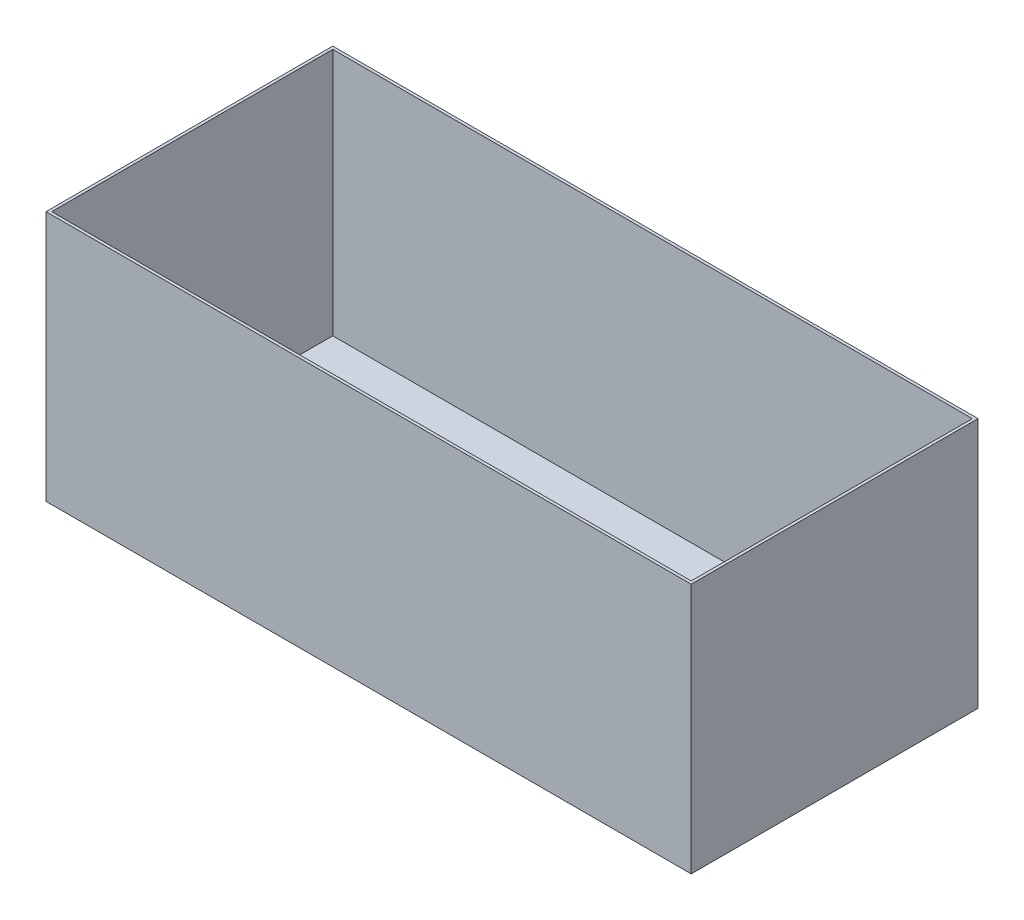
ISO-10303-21;
HEADER;
FILE_DESCRIPTION(('STEP AP214'),'2;1');
FILE_NAME('part.step','',(''),(''),'','','');
FILE_SCHEMA(('AUTOMOTIVE_DESIGN { 1 0 10303 214 1 1 1 1 }'));
ENDSEC;
DATA;
#1=APPLICATION_CONTEXT('core data for automotive mechanical design processes');
#2=APPLICATION_PROTOCOL_DEFINITION('international standard','automotive_design',2000,#1);
#3=PRODUCT_CONTEXT('',#1,'mechanical');
#4=PRODUCT('Part','Part','',(#3));
#5=PRODUCT_RELATED_PRODUCT_CATEGORY('part','',(#4));
#6=PRODUCT_DEFINITION_FORMATION('','',#4);
#7=PRODUCT_DEFINITION_CONTEXT('part definition',#1,'design');
#8=PRODUCT_DEFINITION('design','',#6,#7);
#9=PRODUCT_DEFINITION_SHAPE('','',#8);
#10=(LENGTH_UNIT() NAMED_UNIT(*) SI_UNIT(.MILLI.,.METRE.));
#11=(NAMED_UNIT(*) PLANE_ANGLE_UNIT() SI_UNIT($,.RADIAN.));
#12=(NAMED_UNIT(*) SI_UNIT($,.STERADIAN.) SOLID_ANGLE_UNIT());
#13=UNCERTAINTY_MEASURE_WITH_UNIT(LENGTH_MEASURE(1.E-05),#10,'distance_accuracy_value','');
#14=(GEOMETRIC_REPRESENTATION_CONTEXT(3) GLOBAL_UNCERTAINTY_ASSIGNED_CONTEXT((#13)) GLOBAL_UNIT_ASSIGNED_CONTEXT((#10,
#11,#12)) REPRESENTATION_CONTEXT('',''));
#15=CARTESIAN_POINT('',(0.,0.,0.));
#16=DIRECTION('',(0.,0.,1.));
#17=DIRECTION('',(1.,0.,0.));
#18=AXIS2_PLACEMENT_3D('',#15,#16,#17);
#19=CARTESIAN_POINT('',(0.,88.9,0.));
#20=DIRECTION('',(0.,-1.,0.));
#21=DIRECTION('',(0.,0.,-1.));
#22=AXIS2_PLACEMENT_3D('',#19,#20,#21);
#23=PLANE('',#22);
#24=DIRECTION('',(0.,0.,1.));
#25=VECTOR('',#24,1.);
#26=CARTESIAN_POINT('',(0.,88.9,8.4924012158055));
#27=LINE('',#26,#25);
#28=CARTESIAN_POINT('',(0.,88.9,-93.1075987841945));
#29=VERTEX_POINT('',#28);
#30=CARTESIAN_POINT('',(0.,88.9,8.4924012158055));
#31=VERTEX_POINT('',#30);
#32=EDGE_CURVE('E157',#29,#31,#27,.T.);
#33=ORIENTED_EDGE('',*,*,#32,.T.);
#34=DIRECTION('',(1.,0.,0.));
#35=VECTOR('',#34,1.);
#36=CARTESIAN_POINT('',(0.,88.9,8.4924012158055));
#37=LINE('',#36,#35);
#38=CARTESIAN_POINT('',(228.6,88.9,8.4924012158055));
#39=VERTEX_POINT('',#38);
#40=EDGE_CURVE('E92',#31,#39,#37,.T.);
#41=ORIENTED_EDGE('',*,*,#40,.T.);
#42=DIRECTION('',(0.,0.,-1.));
#43=VECTOR('',#42,1.);
#44=CARTESIAN_POINT('',(228.6,88.9,8.4924012158055));
#45=LINE('',#44,#43);
#46=CARTESIAN_POINT('',(228.6,88.9,-93.1075987841945));
#47=VERTEX_POINT('',#46);
#48=EDGE_CURVE('E162',#39,#47,#45,.T.);
#49=ORIENTED_EDGE('',*,*,#48,.T.);
#50=DIRECTION('',(-1.,0.,0.));
#51=VECTOR('',#50,1.);
#52=CARTESIAN_POINT('',(0.,88.9,-93.1075987841945));
#53=LINE('',#52,#51);
#54=EDGE_CURVE('E64',#47,#29,#53,.T.);
#55=ORIENTED_EDGE('',*,*,#54,.T.);
#56=EDGE_LOOP('',(#33,#41,#49,#55));
#57=FACE_BOUND('',#56,.T.);
#58=DIRECTION('',(0.,0.,1.));
#59=VECTOR('',#58,1.);
#60=CARTESIAN_POINT('',(1.,88.9,0.));
#61=LINE('',#60,#59);
#62=CARTESIAN_POINT('',(1.,88.9,-92.1075987841945));
#63=VERTEX_POINT('',#62);
#64=CARTESIAN_POINT('',(1.,88.9,7.4924012158055));
#65=VERTEX_POINT('',#64);
#66=EDGE_CURVE('E141',#63,#65,#61,.T.);
#67=ORIENTED_EDGE('',*,*,#66,.F.);
#68=DIRECTION('',(-1.,0.,0.));
#69=VECTOR('',#68,1.);
#70=CARTESIAN_POINT('',(0.,88.9,-92.1075987841945));
#71=LINE('',#70,#69);
#72=CARTESIAN_POINT('',(227.6,88.9,-92.1075987841945));
#73=VERTEX_POINT('',#72);
#74=EDGE_CURVE('E154',#73,#63,#71,.T.);
#75=ORIENTED_EDGE('',*,*,#74,.F.);
#76=DIRECTION('',(0.,0.,-1.));
#77=VECTOR('',#76,1.);
#78=CARTESIAN_POINT('',(227.6,88.9,0.));
#79=LINE('',#78,#77);
#80=CARTESIAN_POINT('',(227.6,88.9,7.4924012158055));
#81=VERTEX_POINT('',#80);
#82=EDGE_CURVE('E151',#81,#73,#79,.T.);
#83=ORIENTED_EDGE('',*,*,#82,.F.);
#84=DIRECTION('',(1.,0.,0.));
#85=VECTOR('',#84,1.);
#86=CARTESIAN_POINT('',(0.,88.9,7.4924012158055));
#87=LINE('',#86,#85);
#88=EDGE_CURVE('E130',#65,#81,#87,.T.);
#89=ORIENTED_EDGE('',*,*,#88,.F.);
#90=EDGE_LOOP('',(#67,#75,#83,#89));
#91=FACE_BOUND('',#90,.T.);
#92=ADVANCED_FACE('F39',(#57,#91),#23,.F.);
#93=CARTESIAN_POINT('',(0.,88.9,8.4924012158055));
#94=DIRECTION('',(1.,0.,0.));
#95=DIRECTION('',(0.,0.,-1.));
#96=AXIS2_PLACEMENT_3D('',#93,#94,#95);
#97=PLANE('',#96);
#98=DIRECTION('',(0.,0.,1.));
#99=VECTOR('',#98,1.);
#100=CARTESIAN_POINT('',(0.,0.,8.4924012158055));
#101=LINE('',#100,#99);
#102=CARTESIAN_POINT('',(0.,0.,-93.1075987841945));
#103=VERTEX_POINT('',#102);
#104=CARTESIAN_POINT('',(0.,0.,8.4924012158055));
#105=VERTEX_POINT('',#104);
#106=EDGE_CURVE('E168',#103,#105,#101,.T.);
#107=ORIENTED_EDGE('',*,*,#106,.T.);
#108=DIRECTION('',(0.,-1.,0.));
#109=VECTOR('',#108,1.);
#110=CARTESIAN_POINT('',(0.,88.9,8.4924012158055));
#111=LINE('',#110,#109);
#112=EDGE_CURVE('E11',#31,#105,#111,.T.);
#113=ORIENTED_EDGE('',*,*,#112,.F.);
#114=ORIENTED_EDGE('',*,*,#32,.F.);
#115=DIRECTION('',(0.,-1.,0.));
#116=VECTOR('',#115,1.);
#117=CARTESIAN_POINT('',(0.,88.9,-93.1075987841945));
#118=LINE('',#117,#116);
#119=EDGE_CURVE('E167',#29,#103,#118,.T.);
#120=ORIENTED_EDGE('',*,*,#119,.T.);
#121=EDGE_LOOP('',(#107,#113,#114,#120));
#122=FACE_BOUND('',#121,.T.);
#123=ADVANCED_FACE('F41',(#122),#97,.F.);
#124=CARTESIAN_POINT('',(0.,88.9,8.4924012158055));
#125=DIRECTION('',(0.,0.,-1.));
#126=DIRECTION('',(-1.,0.,0.));
#127=AXIS2_PLACEMENT_3D('',#124,#125,#126);
#128=PLANE('',#127);
#129=DIRECTION('',(1.,0.,0.));
#130=VECTOR('',#129,1.);
#131=CARTESIAN_POINT('',(0.,0.,8.4924012158055));
#132=LINE('',#131,#130);
#133=CARTESIAN_POINT('',(228.6,0.,8.4924012158055));
#134=VERTEX_POINT('',#133);
#135=EDGE_CURVE('E172',#105,#134,#132,.T.);
#136=ORIENTED_EDGE('',*,*,#135,.T.);
#137=DIRECTION('',(0.,-1.,0.));
#138=VECTOR('',#137,1.);
#139=CARTESIAN_POINT('',(228.6,88.9,8.4924012158055));
#140=LINE('',#139,#138);
#141=EDGE_CURVE('E48',#39,#134,#140,.T.);
#142=ORIENTED_EDGE('',*,*,#141,.F.);
#143=ORIENTED_EDGE('',*,*,#40,.F.);
#144=ORIENTED_EDGE('',*,*,#112,.T.);
#145=EDGE_LOOP('',(#136,#142,#143,#144));
#146=FACE_BOUND('',#145,.T.);
#147=ADVANCED_FACE('F206',(#146),#128,.F.);
#148=CARTESIAN_POINT('',(228.6,88.9,8.4924012158055));
#149=DIRECTION('',(-1.,0.,0.));
#150=DIRECTION('',(0.,0.,1.));
#151=AXIS2_PLACEMENT_3D('',#148,#149,#150);
#152=PLANE('',#151);
#153=DIRECTION('',(0.,0.,-1.));
#154=VECTOR('',#153,1.);
#155=CARTESIAN_POINT('',(228.6,0.,8.4924012158055));
#156=LINE('',#155,#154);
#157=CARTESIAN_POINT('',(228.6,0.,-93.1075987841945));
#158=VERTEX_POINT('',#157);
#159=EDGE_CURVE('E175',#134,#158,#156,.T.);
#160=ORIENTED_EDGE('',*,*,#159,.T.);
#161=DIRECTION('',(0.,-1.,0.));
#162=VECTOR('',#161,1.);
#163=CARTESIAN_POINT('',(228.6,88.9,-93.1075987841945));
#164=LINE('',#163,#162);
#165=EDGE_CURVE('E182',#47,#158,#164,.T.);
#166=ORIENTED_EDGE('',*,*,#165,.F.);
#167=ORIENTED_EDGE('',*,*,#48,.F.);
#168=ORIENTED_EDGE('',*,*,#141,.T.);
#169=EDGE_LOOP('',(#160,#166,#167,#168));
#170=FACE_BOUND('',#169,.T.);
#171=ADVANCED_FACE('F189',(#170),#152,.F.);
#172=CARTESIAN_POINT('',(0.,88.9,-93.1075987841945));
#173=DIRECTION('',(0.,0.,1.));
#174=DIRECTION('',(1.,0.,0.));
#175=AXIS2_PLACEMENT_3D('',#172,#173,#174);
#176=PLANE('',#175);
#177=DIRECTION('',(-1.,0.,0.));
#178=VECTOR('',#177,1.);
#179=CARTESIAN_POINT('',(0.,0.,-93.1075987841945));
#180=LINE('',#179,#178);
#181=EDGE_CURVE('E85',#158,#103,#180,.T.);
#182=ORIENTED_EDGE('',*,*,#181,.T.);
#183=ORIENTED_EDGE('',*,*,#119,.F.);
#184=ORIENTED_EDGE('',*,*,#54,.F.);
#185=ORIENTED_EDGE('',*,*,#165,.T.);
#186=EDGE_LOOP('',(#182,#183,#184,#185));
#187=FACE_BOUND('',#186,.T.);
#188=ADVANCED_FACE('F197',(#187),#176,.F.);
#189=CARTESIAN_POINT('',(0.,0.,0.));
#190=DIRECTION('',(0.,-1.,0.));
#191=DIRECTION('',(0.,0.,-1.));
#192=AXIS2_PLACEMENT_3D('',#189,#190,#191);
#193=PLANE('',#192);
#194=ORIENTED_EDGE('',*,*,#106,.F.);
#195=ORIENTED_EDGE('',*,*,#181,.F.);
#196=ORIENTED_EDGE('',*,*,#159,.F.);
#197=ORIENTED_EDGE('',*,*,#135,.F.);
#198=EDGE_LOOP('',(#194,#195,#196,#197));
#199=FACE_BOUND('',#198,.T.);
#200=ADVANCED_FACE('F193',(#199),#193,.T.);
#201=CARTESIAN_POINT('',(1.,88.9,8.4924012158055));
#202=DIRECTION('',(1.,0.,0.));
#203=DIRECTION('',(0.,0.,-1.));
#204=AXIS2_PLACEMENT_3D('',#201,#202,#203);
#205=PLANE('',#204);
#206=DIRECTION('',(0.,0.,1.));
#207=VECTOR('',#206,1.);
#208=CARTESIAN_POINT('',(1.,1.,0.));
#209=LINE('',#208,#207);
#210=CARTESIAN_POINT('',(1.,1.,-92.1075987841945));
#211=VERTEX_POINT('',#210);
#212=CARTESIAN_POINT('',(1.,1.,7.4924012158055));
#213=VERTEX_POINT('',#212);
#214=EDGE_CURVE('E120',#211,#213,#209,.T.);
#215=ORIENTED_EDGE('',*,*,#214,.F.);
#216=DIRECTION('',(0.,-1.,0.));
#217=VECTOR('',#216,1.);
#218=CARTESIAN_POINT('',(1.,88.9,-92.1075987841945));
#219=LINE('',#218,#217);
#220=EDGE_CURVE('E145',#63,#211,#219,.T.);
#221=ORIENTED_EDGE('',*,*,#220,.F.);
#222=ORIENTED_EDGE('',*,*,#66,.T.);
#223=DIRECTION('',(0.,-1.,0.));
#224=VECTOR('',#223,1.);
#225=CARTESIAN_POINT('',(1.,88.9,7.4924012158055));
#226=LINE('',#225,#224);
#227=EDGE_CURVE('E134',#65,#213,#226,.T.);
#228=ORIENTED_EDGE('',*,*,#227,.T.);
#229=EDGE_LOOP('',(#215,#221,#222,#228));
#230=FACE_BOUND('',#229,.T.);
#231=ADVANCED_FACE('F204',(#230),#205,.T.);
#232=CARTESIAN_POINT('',(0.,88.9,7.4924012158055));
#233=DIRECTION('',(0.,0.,-1.));
#234=DIRECTION('',(-1.,0.,0.));
#235=AXIS2_PLACEMENT_3D('',#232,#233,#234);
#236=PLANE('',#235);
#237=DIRECTION('',(1.,0.,0.));
#238=VECTOR('',#237,1.);
#239=CARTESIAN_POINT('',(0.,1.,7.4924012158055));
#240=LINE('',#239,#238);
#241=CARTESIAN_POINT('',(227.6,1.,7.4924012158055));
#242=VERTEX_POINT('',#241);
#243=EDGE_CURVE('E114',#213,#242,#240,.T.);
#244=ORIENTED_EDGE('',*,*,#243,.F.);
#245=ORIENTED_EDGE('',*,*,#227,.F.);
#246=ORIENTED_EDGE('',*,*,#88,.T.);
#247=DIRECTION('',(0.,-1.,0.));
#248=VECTOR('',#247,1.);
#249=CARTESIAN_POINT('',(227.6,88.9,7.4924012158055));
#250=LINE('',#249,#248);
#251=EDGE_CURVE('E127',#81,#242,#250,.T.);
#252=ORIENTED_EDGE('',*,*,#251,.T.);
#253=EDGE_LOOP('',(#244,#245,#246,#252));
#254=FACE_BOUND('',#253,.T.);
#255=ADVANCED_FACE('F128',(#254),#236,.T.);
#256=CARTESIAN_POINT('',(227.6,88.9,8.4924012158055));
#257=DIRECTION('',(-1.,0.,0.));
#258=DIRECTION('',(0.,0.,1.));
#259=AXIS2_PLACEMENT_3D('',#256,#257,#258);
#260=PLANE('',#259);
#261=DIRECTION('',(0.,0.,-1.));
#262=VECTOR('',#261,1.);
#263=CARTESIAN_POINT('',(227.6,1.,0.));
#264=LINE('',#263,#262);
#265=CARTESIAN_POINT('',(227.6,1.,-92.1075987841945));
#266=VERTEX_POINT('',#265);
#267=EDGE_CURVE('E118',#242,#266,#264,.T.);
#268=ORIENTED_EDGE('',*,*,#267,.F.);
#269=ORIENTED_EDGE('',*,*,#251,.F.);
#270=ORIENTED_EDGE('',*,*,#82,.T.);
#271=DIRECTION('',(0.,-1.,0.));
#272=VECTOR('',#271,1.);
#273=CARTESIAN_POINT('',(227.6,88.9,-92.1075987841945));
#274=LINE('',#273,#272);
#275=EDGE_CURVE('E55',#73,#266,#274,.T.);
#276=ORIENTED_EDGE('',*,*,#275,.T.);
#277=EDGE_LOOP('',(#268,#269,#270,#276));
#278=FACE_BOUND('',#277,.T.);
#279=ADVANCED_FACE('F136',(#278),#260,.T.);
#280=CARTESIAN_POINT('',(0.,88.9,-92.1075987841945));
#281=DIRECTION('',(0.,0.,1.));
#282=DIRECTION('',(1.,0.,0.));
#283=AXIS2_PLACEMENT_3D('',#280,#281,#282);
#284=PLANE('',#283);
#285=DIRECTION('',(-1.,0.,0.));
#286=VECTOR('',#285,1.);
#287=CARTESIAN_POINT('',(0.,1.,-92.1075987841945));
#288=LINE('',#287,#286);
#289=EDGE_CURVE('E138',#266,#211,#288,.T.);
#290=ORIENTED_EDGE('',*,*,#289,.F.);
#291=ORIENTED_EDGE('',*,*,#275,.F.);
#292=ORIENTED_EDGE('',*,*,#74,.T.);
#293=ORIENTED_EDGE('',*,*,#220,.T.);
#294=EDGE_LOOP('',(#290,#291,#292,#293));
#295=FACE_BOUND('',#294,.T.);
#296=ADVANCED_FACE('F217',(#295),#284,.T.);
#297=CARTESIAN_POINT('',(0.,1.,0.));
#298=DIRECTION('',(0.,-1.,0.));
#299=DIRECTION('',(0.,0.,-1.));
#300=AXIS2_PLACEMENT_3D('',#297,#298,#299);
#301=PLANE('',#300);
#302=ORIENTED_EDGE('',*,*,#214,.T.);
#303=ORIENTED_EDGE('',*,*,#243,.T.);
#304=ORIENTED_EDGE('',*,*,#267,.T.);
#305=ORIENTED_EDGE('',*,*,#289,.T.);
#306=EDGE_LOOP('',(#302,#303,#304,#305));
#307=FACE_BOUND('',#306,.T.);
#308=ADVANCED_FACE('F116',(#307),#301,.F.);
#309=CLOSED_SHELL('',(#92,#123,#147,#171,#188,#200,#231,#255,#279,#296,#308));
#310=MANIFOLD_SOLID_BREP('B2',#309);
#311=ADVANCED_BREP_SHAPE_REPRESENTATION('',(#18,#310),#14);
#312=SHAPE_DEFINITION_REPRESENTATION(#9,#311);
ENDSEC;
END-ISO-10303-21;
